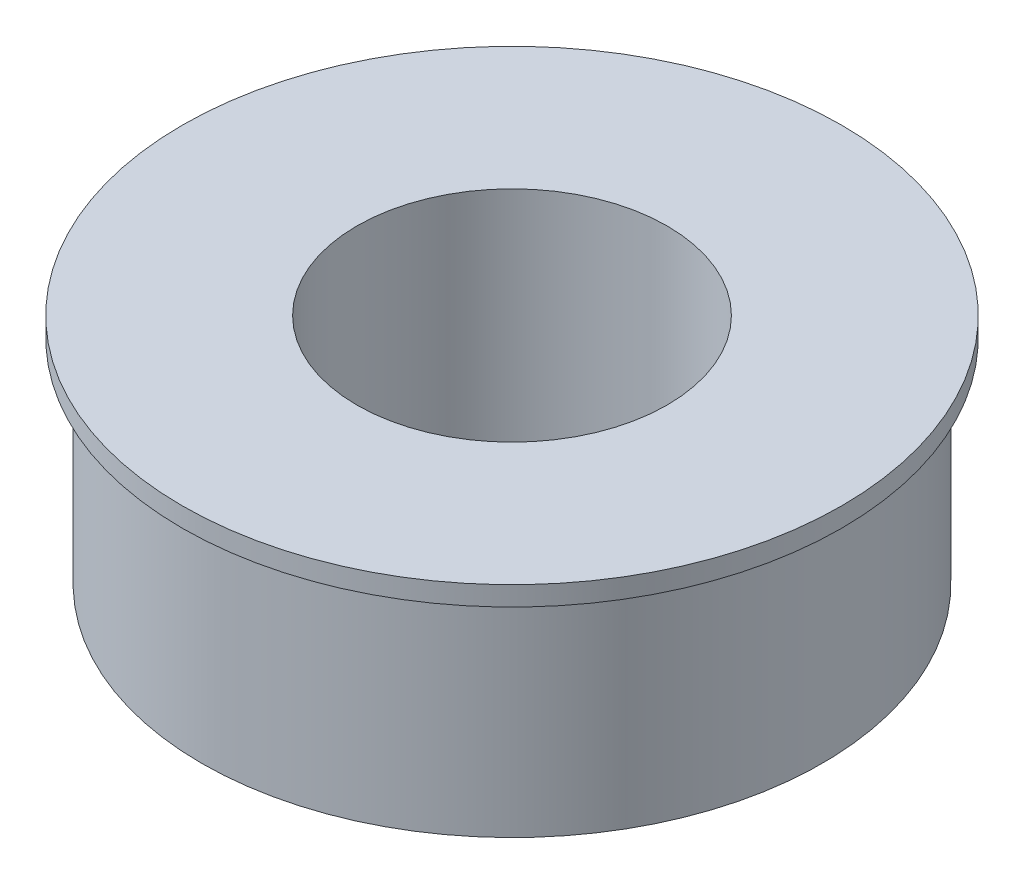
ISO-10303-21;
HEADER;
FILE_DESCRIPTION(('STEP AP214'),'2;1');
FILE_NAME('part.step','',(''),(''),'','','');
FILE_SCHEMA(('AUTOMOTIVE_DESIGN { 1 0 10303 214 1 1 1 1 }'));
ENDSEC;
DATA;
#1=APPLICATION_CONTEXT('core data for automotive mechanical design processes');
#2=APPLICATION_PROTOCOL_DEFINITION('international standard','automotive_design',2000,#1);
#3=PRODUCT_CONTEXT('',#1,'mechanical');
#4=PRODUCT('Part','Part','',(#3));
#5=PRODUCT_RELATED_PRODUCT_CATEGORY('part','',(#4));
#6=PRODUCT_DEFINITION_FORMATION('','',#4);
#7=PRODUCT_DEFINITION_CONTEXT('part definition',#1,'design');
#8=PRODUCT_DEFINITION('design','',#6,#7);
#9=PRODUCT_DEFINITION_SHAPE('','',#8);
#10=(LENGTH_UNIT() NAMED_UNIT(*) SI_UNIT(.MILLI.,.METRE.));
#11=(NAMED_UNIT(*) PLANE_ANGLE_UNIT() SI_UNIT($,.RADIAN.));
#12=(NAMED_UNIT(*) SI_UNIT($,.STERADIAN.) SOLID_ANGLE_UNIT());
#13=UNCERTAINTY_MEASURE_WITH_UNIT(LENGTH_MEASURE(1.E-05),#10,'distance_accuracy_value','');
#14=(GEOMETRIC_REPRESENTATION_CONTEXT(3) GLOBAL_UNCERTAINTY_ASSIGNED_CONTEXT((#13)) GLOBAL_UNIT_ASSIGNED_CONTEXT((#10,
#11,#12)) REPRESENTATION_CONTEXT('',''));
#15=CARTESIAN_POINT('',(0.,0.,0.));
#16=DIRECTION('',(0.,0.,1.));
#17=DIRECTION('',(1.,0.,0.));
#18=AXIS2_PLACEMENT_3D('',#15,#16,#17);
#19=CARTESIAN_POINT('',(0.,0.,0.));
#20=DIRECTION('',(0.,1.,0.));
#21=DIRECTION('',(0.,0.,1.));
#22=AXIS2_PLACEMENT_3D('',#19,#20,#21);
#23=PLANE('',#22);
#24=CARTESIAN_POINT('',(0.,0.,0.));
#25=DIRECTION('',(0.,1.,0.));
#26=DIRECTION('',(0.,0.,1.));
#27=AXIS2_PLACEMENT_3D('',#24,#25,#26);
#28=CIRCLE('',#27,25.4);
#29=CARTESIAN_POINT('',(0.,0.,25.4));
#30=VERTEX_POINT('',#29);
#31=EDGE_CURVE('E35',#30,#30,#28,.T.);
#32=ORIENTED_EDGE('',*,*,#31,.F.);
#33=EDGE_LOOP('',(#32));
#34=FACE_BOUND('',#33,.T.);
#35=CARTESIAN_POINT('',(0.,0.,0.));
#36=DIRECTION('',(0.,1.,0.));
#37=DIRECTION('',(0.,0.,1.));
#38=AXIS2_PLACEMENT_3D('',#35,#36,#37);
#39=CIRCLE('',#38,12.7);
#40=CARTESIAN_POINT('',(0.,0.,12.7));
#41=VERTEX_POINT('',#40);
#42=EDGE_CURVE('E42',#41,#41,#39,.T.);
#43=ORIENTED_EDGE('',*,*,#42,.T.);
#44=EDGE_LOOP('',(#43));
#45=FACE_BOUND('',#44,.T.);
#46=ADVANCED_FACE('F31',(#34,#45),#23,.F.);
#47=CARTESIAN_POINT('',(0.,17.4625,0.));
#48=DIRECTION('',(0.,-1.,0.));
#49=DIRECTION('',(0.,0.,-1.));
#50=AXIS2_PLACEMENT_3D('',#47,#48,#49);
#51=CYLINDRICAL_SURFACE('',#50,25.4);
#52=CARTESIAN_POINT('',(0.,17.4625,0.));
#53=DIRECTION('',(0.,1.,0.));
#54=DIRECTION('',(0.,0.,1.));
#55=AXIS2_PLACEMENT_3D('',#52,#53,#54);
#56=CIRCLE('',#55,25.4);
#57=CARTESIAN_POINT('',(0.,17.4625,25.4));
#58=VERTEX_POINT('',#57);
#59=EDGE_CURVE('E10',#58,#58,#56,.T.);
#60=ORIENTED_EDGE('',*,*,#59,.F.);
#61=EDGE_LOOP('',(#60));
#62=FACE_BOUND('',#61,.T.);
#63=ORIENTED_EDGE('',*,*,#31,.T.);
#64=EDGE_LOOP('',(#63));
#65=FACE_BOUND('',#64,.T.);
#66=ADVANCED_FACE('F33',(#62,#65),#51,.T.);
#67=CARTESIAN_POINT('',(0.,17.4625,0.));
#68=DIRECTION('',(0.,-1.,0.));
#69=DIRECTION('',(0.,0.,-1.));
#70=AXIS2_PLACEMENT_3D('',#67,#68,#69);
#71=CYLINDRICAL_SURFACE('',#70,12.7);
#72=ORIENTED_EDGE('',*,*,#42,.F.);
#73=EDGE_LOOP('',(#72));
#74=FACE_BOUND('',#73,.T.);
#75=CARTESIAN_POINT('',(0.,19.05,0.));
#76=DIRECTION('',(0.,1.,0.));
#77=DIRECTION('',(0.,0.,1.));
#78=AXIS2_PLACEMENT_3D('',#75,#76,#77);
#79=CIRCLE('',#78,12.7);
#80=CARTESIAN_POINT('',(0.,19.05,12.7));
#81=VERTEX_POINT('',#80);
#82=EDGE_CURVE('E50',#81,#81,#79,.T.);
#83=ORIENTED_EDGE('',*,*,#82,.T.);
#84=EDGE_LOOP('',(#83));
#85=FACE_BOUND('',#84,.T.);
#86=ADVANCED_FACE('F56',(#74,#85),#71,.F.);
#87=CARTESIAN_POINT('',(0.,17.4625,0.));
#88=DIRECTION('',(0.,1.,0.));
#89=DIRECTION('',(0.,0.,1.));
#90=AXIS2_PLACEMENT_3D('',#87,#88,#89);
#91=PLANE('',#90);
#92=CARTESIAN_POINT('',(0.,17.4625,0.));
#93=DIRECTION('',(0.,1.,0.));
#94=DIRECTION('',(0.,0.,1.));
#95=AXIS2_PLACEMENT_3D('',#92,#93,#94);
#96=CIRCLE('',#95,26.9875);
#97=CARTESIAN_POINT('',(0.,17.4625,26.9875));
#98=VERTEX_POINT('',#97);
#99=EDGE_CURVE('E47',#98,#98,#96,.T.);
#100=ORIENTED_EDGE('',*,*,#99,.F.);
#101=EDGE_LOOP('',(#100));
#102=FACE_BOUND('',#101,.T.);
#103=ORIENTED_EDGE('',*,*,#59,.T.);
#104=EDGE_LOOP('',(#103));
#105=FACE_BOUND('',#104,.T.);
#106=ADVANCED_FACE('F61',(#102,#105),#91,.F.);
#107=CARTESIAN_POINT('',(0.,19.05,0.));
#108=DIRECTION('',(0.,1.,0.));
#109=DIRECTION('',(0.,0.,1.));
#110=AXIS2_PLACEMENT_3D('',#107,#108,#109);
#111=PLANE('',#110);
#112=CARTESIAN_POINT('',(0.,19.05,0.));
#113=DIRECTION('',(0.,1.,0.));
#114=DIRECTION('',(0.,0.,1.));
#115=AXIS2_PLACEMENT_3D('',#112,#113,#114);
#116=CIRCLE('',#115,26.9875);
#117=CARTESIAN_POINT('',(0.,19.05,26.9875));
#118=VERTEX_POINT('',#117);
#119=EDGE_CURVE('E46',#118,#118,#116,.T.);
#120=ORIENTED_EDGE('',*,*,#119,.T.);
#121=EDGE_LOOP('',(#120));
#122=FACE_BOUND('',#121,.T.);
#123=ORIENTED_EDGE('',*,*,#82,.F.);
#124=EDGE_LOOP('',(#123));
#125=FACE_BOUND('',#124,.T.);
#126=ADVANCED_FACE('F58',(#122,#125),#111,.T.);
#127=CARTESIAN_POINT('',(0.,19.05,0.));
#128=DIRECTION('',(0.,-1.,0.));
#129=DIRECTION('',(0.,0.,-1.));
#130=AXIS2_PLACEMENT_3D('',#127,#128,#129);
#131=CYLINDRICAL_SURFACE('',#130,26.9875);
#132=ORIENTED_EDGE('',*,*,#119,.F.);
#133=EDGE_LOOP('',(#132));
#134=FACE_BOUND('',#133,.T.);
#135=ORIENTED_EDGE('',*,*,#99,.T.);
#136=EDGE_LOOP('',(#135));
#137=FACE_BOUND('',#136,.T.);
#138=ADVANCED_FACE('F60',(#134,#137),#131,.T.);
#139=CLOSED_SHELL('',(#46,#66,#86,#106,#126,#138));
#140=MANIFOLD_SOLID_BREP('B2',#139);
#141=ADVANCED_BREP_SHAPE_REPRESENTATION('',(#18,#140),#14);
#142=SHAPE_DEFINITION_REPRESENTATION(#9,#141);
ENDSEC;
END-ISO-10303-21;
